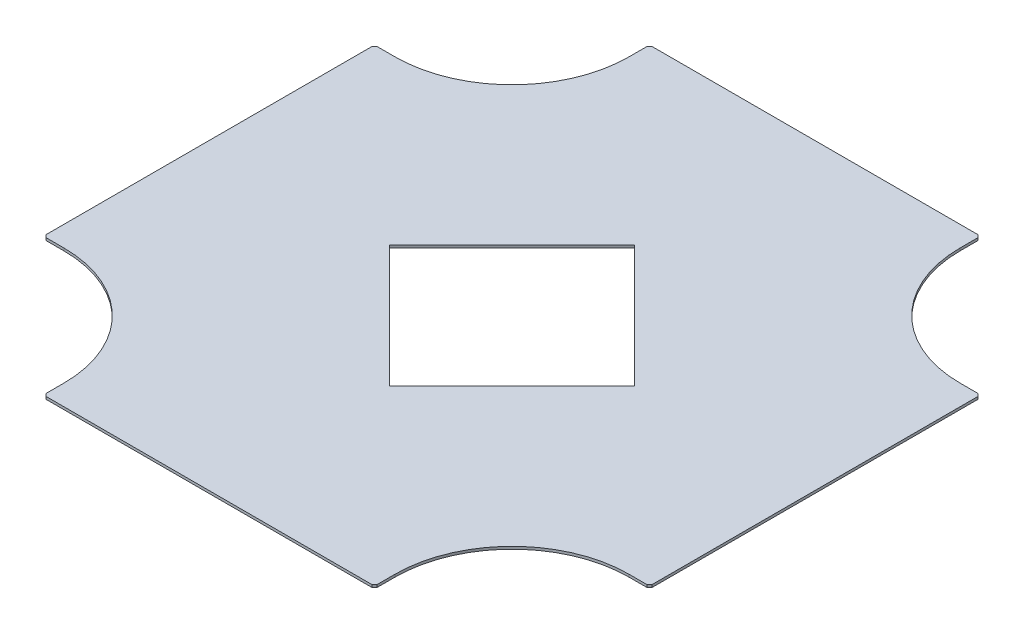
ISO-10303-21;
HEADER;
FILE_DESCRIPTION(('STEP AP214'),'2;1');
FILE_NAME('part.step','',(''),(''),'','','');
FILE_SCHEMA(('AUTOMOTIVE_DESIGN { 1 0 10303 214 1 1 1 1 }'));
ENDSEC;
DATA;
#1=APPLICATION_CONTEXT('core data for automotive mechanical design processes');
#2=APPLICATION_PROTOCOL_DEFINITION('international standard','automotive_design',2000,#1);
#3=PRODUCT_CONTEXT('',#1,'mechanical');
#4=PRODUCT('Part','Part','',(#3));
#5=PRODUCT_RELATED_PRODUCT_CATEGORY('part','',(#4));
#6=PRODUCT_DEFINITION_FORMATION('','',#4);
#7=PRODUCT_DEFINITION_CONTEXT('part definition',#1,'design');
#8=PRODUCT_DEFINITION('design','',#6,#7);
#9=PRODUCT_DEFINITION_SHAPE('','',#8);
#10=(LENGTH_UNIT() NAMED_UNIT(*) SI_UNIT(.MILLI.,.METRE.));
#11=(NAMED_UNIT(*) PLANE_ANGLE_UNIT() SI_UNIT($,.RADIAN.));
#12=(NAMED_UNIT(*) SI_UNIT($,.STERADIAN.) SOLID_ANGLE_UNIT());
#13=UNCERTAINTY_MEASURE_WITH_UNIT(LENGTH_MEASURE(1.E-05),#10,'distance_accuracy_value','');
#14=(GEOMETRIC_REPRESENTATION_CONTEXT(3) GLOBAL_UNCERTAINTY_ASSIGNED_CONTEXT((#13)) GLOBAL_UNIT_ASSIGNED_CONTEXT((#10,
#11,#12)) REPRESENTATION_CONTEXT('',''));
#15=CARTESIAN_POINT('',(0.,0.,0.));
#16=DIRECTION('',(0.,0.,1.));
#17=DIRECTION('',(1.,0.,0.));
#18=AXIS2_PLACEMENT_3D('',#15,#16,#17);
#19=CARTESIAN_POINT('',(377.825,-3.175,377.825));
#20=DIRECTION('',(1.,0.,0.));
#21=DIRECTION('',(0.,0.,-1.));
#22=AXIS2_PLACEMENT_3D('',#19,#20,#21);
#23=PLANE('',#22);
#24=DIRECTION('',(0.,0.,-1.));
#25=VECTOR('',#24,1.);
#26=CARTESIAN_POINT('',(377.825,-3.175,377.825));
#27=LINE('',#26,#25);
#28=CARTESIAN_POINT('',(377.825,-3.175,203.2));
#29=VERTEX_POINT('',#28);
#30=CARTESIAN_POINT('',(377.825,-3.175,-203.2));
#31=VERTEX_POINT('',#30);
#32=EDGE_CURVE('E402',#29,#31,#27,.T.);
#33=ORIENTED_EDGE('',*,*,#32,.T.);
#34=DIRECTION('',(0.,1.,0.));
#35=VECTOR('',#34,1.);
#36=CARTESIAN_POINT('',(377.825,0.,-203.2));
#37=LINE('',#36,#35);
#38=CARTESIAN_POINT('',(377.825,0.,-203.2));
#39=VERTEX_POINT('',#38);
#40=EDGE_CURVE('E493',#31,#39,#37,.T.);
#41=ORIENTED_EDGE('',*,*,#40,.T.);
#42=DIRECTION('',(0.,0.,-1.));
#43=VECTOR('',#42,1.);
#44=CARTESIAN_POINT('',(377.825,0.,377.825));
#45=LINE('',#44,#43);
#46=CARTESIAN_POINT('',(377.825,0.,203.2));
#47=VERTEX_POINT('',#46);
#48=EDGE_CURVE('E393',#47,#39,#45,.T.);
#49=ORIENTED_EDGE('',*,*,#48,.F.);
#50=DIRECTION('',(0.,-1.,0.));
#51=VECTOR('',#50,1.);
#52=CARTESIAN_POINT('',(377.825,-3.175,203.2));
#53=LINE('',#52,#51);
#54=EDGE_CURVE('E489',#47,#29,#53,.T.);
#55=ORIENTED_EDGE('',*,*,#54,.T.);
#56=EDGE_LOOP('',(#33,#41,#49,#55));
#57=FACE_BOUND('',#56,.T.);
#58=ADVANCED_FACE('F55',(#57),#23,.T.);
#59=CARTESIAN_POINT('',(-377.825,-3.175,377.825));
#60=DIRECTION('',(0.,0.,1.));
#61=DIRECTION('',(1.,0.,0.));
#62=AXIS2_PLACEMENT_3D('',#59,#60,#61);
#63=PLANE('',#62);
#64=DIRECTION('',(1.,0.,0.));
#65=VECTOR('',#64,1.);
#66=CARTESIAN_POINT('',(-377.825,-3.175,377.825));
#67=LINE('',#66,#65);
#68=CARTESIAN_POINT('',(-203.2,-3.175,377.825));
#69=VERTEX_POINT('',#68);
#70=CARTESIAN_POINT('',(203.2,-3.175,377.825));
#71=VERTEX_POINT('',#70);
#72=EDGE_CURVE('E414',#69,#71,#67,.T.);
#73=ORIENTED_EDGE('',*,*,#72,.T.);
#74=DIRECTION('',(0.,1.,0.));
#75=VECTOR('',#74,1.);
#76=CARTESIAN_POINT('',(203.2,0.,377.825));
#77=LINE('',#76,#75);
#78=CARTESIAN_POINT('',(203.2,0.,377.825));
#79=VERTEX_POINT('',#78);
#80=EDGE_CURVE('E476',#71,#79,#77,.T.);
#81=ORIENTED_EDGE('',*,*,#80,.T.);
#82=DIRECTION('',(1.,0.,0.));
#83=VECTOR('',#82,1.);
#84=CARTESIAN_POINT('',(-377.825,0.,377.825));
#85=LINE('',#84,#83);
#86=CARTESIAN_POINT('',(-203.2,0.,377.825));
#87=VERTEX_POINT('',#86);
#88=EDGE_CURVE('E407',#87,#79,#85,.T.);
#89=ORIENTED_EDGE('',*,*,#88,.F.);
#90=DIRECTION('',(0.,-1.,0.));
#91=VECTOR('',#90,1.);
#92=CARTESIAN_POINT('',(-203.2,-3.175,377.825));
#93=LINE('',#92,#91);
#94=EDGE_CURVE('E472',#87,#69,#93,.T.);
#95=ORIENTED_EDGE('',*,*,#94,.T.);
#96=EDGE_LOOP('',(#73,#81,#89,#95));
#97=FACE_BOUND('',#96,.T.);
#98=ADVANCED_FACE('F519',(#97),#63,.T.);
#99=CARTESIAN_POINT('',(-377.825,-3.175,377.825));
#100=DIRECTION('',(-1.,0.,0.));
#101=DIRECTION('',(0.,0.,1.));
#102=AXIS2_PLACEMENT_3D('',#99,#100,#101);
#103=PLANE('',#102);
#104=DIRECTION('',(0.,0.,1.));
#105=VECTOR('',#104,1.);
#106=CARTESIAN_POINT('',(-377.825,-3.175,377.825));
#107=LINE('',#106,#105);
#108=CARTESIAN_POINT('',(-377.825,-3.175,-203.2));
#109=VERTEX_POINT('',#108);
#110=CARTESIAN_POINT('',(-377.825,-3.175,203.2));
#111=VERTEX_POINT('',#110);
#112=EDGE_CURVE('E410',#109,#111,#107,.T.);
#113=ORIENTED_EDGE('',*,*,#112,.T.);
#114=DIRECTION('',(0.,1.,0.));
#115=VECTOR('',#114,1.);
#116=CARTESIAN_POINT('',(-377.825,0.,203.2));
#117=LINE('',#116,#115);
#118=CARTESIAN_POINT('',(-377.825,0.,203.2));
#119=VERTEX_POINT('',#118);
#120=EDGE_CURVE('E458',#111,#119,#117,.T.);
#121=ORIENTED_EDGE('',*,*,#120,.T.);
#122=DIRECTION('',(0.,0.,1.));
#123=VECTOR('',#122,1.);
#124=CARTESIAN_POINT('',(-377.825,0.,377.825));
#125=LINE('',#124,#123);
#126=CARTESIAN_POINT('',(-377.825,0.,-203.2));
#127=VERTEX_POINT('',#126);
#128=EDGE_CURVE('E423',#127,#119,#125,.T.);
#129=ORIENTED_EDGE('',*,*,#128,.F.);
#130=DIRECTION('',(0.,-1.,0.));
#131=VECTOR('',#130,1.);
#132=CARTESIAN_POINT('',(-377.825,-3.175,-203.2));
#133=LINE('',#132,#131);
#134=EDGE_CURVE('E452',#127,#109,#133,.T.);
#135=ORIENTED_EDGE('',*,*,#134,.T.);
#136=EDGE_LOOP('',(#113,#121,#129,#135));
#137=FACE_BOUND('',#136,.T.);
#138=ADVANCED_FACE('F525',(#137),#103,.T.);
#139=CARTESIAN_POINT('',(-377.825,-3.175,-377.825));
#140=DIRECTION('',(0.,0.,-1.));
#141=DIRECTION('',(-1.,0.,0.));
#142=AXIS2_PLACEMENT_3D('',#139,#140,#141);
#143=PLANE('',#142);
#144=DIRECTION('',(-1.,0.,0.));
#145=VECTOR('',#144,1.);
#146=CARTESIAN_POINT('',(-377.825,-3.175,-377.825));
#147=LINE('',#146,#145);
#148=CARTESIAN_POINT('',(203.2,-3.175,-377.825));
#149=VERTEX_POINT('',#148);
#150=CARTESIAN_POINT('',(-203.2,-3.175,-377.825));
#151=VERTEX_POINT('',#150);
#152=EDGE_CURVE('E406',#149,#151,#147,.T.);
#153=ORIENTED_EDGE('',*,*,#152,.T.);
#154=DIRECTION('',(0.,1.,0.));
#155=VECTOR('',#154,1.);
#156=CARTESIAN_POINT('',(-203.2,0.,-377.825));
#157=LINE('',#156,#155);
#158=CARTESIAN_POINT('',(-203.2,0.,-377.825));
#159=VERTEX_POINT('',#158);
#160=EDGE_CURVE('E436',#151,#159,#157,.T.);
#161=ORIENTED_EDGE('',*,*,#160,.T.);
#162=DIRECTION('',(-1.,0.,0.));
#163=VECTOR('',#162,1.);
#164=CARTESIAN_POINT('',(-377.825,0.,-377.825));
#165=LINE('',#164,#163);
#166=CARTESIAN_POINT('',(203.2,0.,-377.825));
#167=VERTEX_POINT('',#166);
#168=EDGE_CURVE('E420',#167,#159,#165,.T.);
#169=ORIENTED_EDGE('',*,*,#168,.F.);
#170=DIRECTION('',(0.,-1.,0.));
#171=VECTOR('',#170,1.);
#172=CARTESIAN_POINT('',(203.2,-3.175,-377.825));
#173=LINE('',#172,#171);
#174=EDGE_CURVE('E432',#167,#149,#173,.T.);
#175=ORIENTED_EDGE('',*,*,#174,.T.);
#176=EDGE_LOOP('',(#153,#161,#169,#175));
#177=FACE_BOUND('',#176,.T.);
#178=ADVANCED_FACE('F530',(#177),#143,.T.);
#179=CARTESIAN_POINT('',(0.,-3.175,0.));
#180=DIRECTION('',(0.,-1.,0.));
#181=DIRECTION('',(0.,0.,-1.));
#182=AXIS2_PLACEMENT_3D('',#179,#180,#181);
#183=PLANE('',#182);
#184=DIRECTION('',(1.,0.,0.));
#185=VECTOR('',#184,1.);
#186=CARTESIAN_POINT('',(377.825,-3.175,-206.375));
#187=LINE('',#186,#185);
#188=CARTESIAN_POINT('',(352.425,-3.175,-206.375));
#189=VERTEX_POINT('',#188);
#190=CARTESIAN_POINT('',(374.65,-3.175,-206.375));
#191=VERTEX_POINT('',#190);
#192=EDGE_CURVE('E346',#189,#191,#187,.T.);
#193=ORIENTED_EDGE('',*,*,#192,.T.);
#194=DIRECTION('',(0.707106781186548,0.,0.707106781186548));
#195=VECTOR('',#194,1.);
#196=CARTESIAN_POINT('',(290.5125,-3.175,-290.5125));
#197=LINE('',#196,#195);
#198=EDGE_CURVE('E11',#191,#31,#197,.T.);
#199=ORIENTED_EDGE('',*,*,#198,.T.);
#200=ORIENTED_EDGE('',*,*,#32,.F.);
#201=DIRECTION('',(-0.707106781186551,0.,0.707106781186544));
#202=VECTOR('',#201,1.);
#203=CARTESIAN_POINT('',(290.512499999998,-3.175,290.512500000001));
#204=LINE('',#203,#202);
#205=CARTESIAN_POINT('',(374.65,-3.175,206.375));
#206=VERTEX_POINT('',#205);
#207=EDGE_CURVE('E491',#29,#206,#204,.T.);
#208=ORIENTED_EDGE('',*,*,#207,.T.);
#209=DIRECTION('',(-1.,0.,0.));
#210=VECTOR('',#209,1.);
#211=CARTESIAN_POINT('',(352.425,-3.175,206.375));
#212=LINE('',#211,#210);
#213=CARTESIAN_POINT('',(352.425,-3.175,206.375));
#214=VERTEX_POINT('',#213);
#215=EDGE_CURVE('E279',#206,#214,#212,.T.);
#216=ORIENTED_EDGE('',*,*,#215,.T.);
#217=CARTESIAN_POINT('',(352.425,-3.175,352.425));
#218=DIRECTION('',(0.,1.,0.));
#219=DIRECTION('',(0.,0.,-1.));
#220=AXIS2_PLACEMENT_3D('',#217,#218,#219);
#221=CIRCLE('',#220,146.05);
#222=CARTESIAN_POINT('',(206.375,-3.175,352.425));
#223=VERTEX_POINT('',#222);
#224=EDGE_CURVE('E281',#214,#223,#221,.T.);
#225=ORIENTED_EDGE('',*,*,#224,.T.);
#226=DIRECTION('',(0.,0.,1.));
#227=VECTOR('',#226,1.);
#228=CARTESIAN_POINT('',(206.375,-3.175,377.825));
#229=LINE('',#228,#227);
#230=CARTESIAN_POINT('',(206.375,-3.175,374.65));
#231=VERTEX_POINT('',#230);
#232=EDGE_CURVE('E261',#223,#231,#229,.T.);
#233=ORIENTED_EDGE('',*,*,#232,.T.);
#234=DIRECTION('',(-0.707106781186544,0.,0.707106781186551));
#235=VECTOR('',#234,1.);
#236=CARTESIAN_POINT('',(290.512500000001,-3.175,290.512499999998));
#237=LINE('',#236,#235);
#238=EDGE_CURVE('E482',#231,#71,#237,.T.);
#239=ORIENTED_EDGE('',*,*,#238,.T.);
#240=ORIENTED_EDGE('',*,*,#72,.F.);
#241=DIRECTION('',(-0.707106781186544,0.,-0.707106781186551));
#242=VECTOR('',#241,1.);
#243=CARTESIAN_POINT('',(-290.512500000001,-3.175,290.512499999998));
#244=LINE('',#243,#242);
#245=CARTESIAN_POINT('',(-206.375,-3.175,374.65));
#246=VERTEX_POINT('',#245);
#247=EDGE_CURVE('E474',#69,#246,#244,.T.);
#248=ORIENTED_EDGE('',*,*,#247,.T.);
#249=DIRECTION('',(0.,0.,-1.));
#250=VECTOR('',#249,1.);
#251=CARTESIAN_POINT('',(-206.375,-3.175,352.425));
#252=LINE('',#251,#250);
#253=CARTESIAN_POINT('',(-206.375,-3.175,352.425));
#254=VERTEX_POINT('',#253);
#255=EDGE_CURVE('E301',#246,#254,#252,.T.);
#256=ORIENTED_EDGE('',*,*,#255,.T.);
#257=CARTESIAN_POINT('',(-352.425,-3.175,352.425));
#258=DIRECTION('',(0.,1.,0.));
#259=DIRECTION('',(0.,0.,-1.));
#260=AXIS2_PLACEMENT_3D('',#257,#258,#259);
#261=CIRCLE('',#260,146.05);
#262=CARTESIAN_POINT('',(-352.425,-3.175,206.375));
#263=VERTEX_POINT('',#262);
#264=EDGE_CURVE('E309',#254,#263,#261,.T.);
#265=ORIENTED_EDGE('',*,*,#264,.T.);
#266=DIRECTION('',(-1.,0.,0.));
#267=VECTOR('',#266,1.);
#268=CARTESIAN_POINT('',(-377.825,-3.175,206.375));
#269=LINE('',#268,#267);
#270=CARTESIAN_POINT('',(-374.65,-3.175,206.375));
#271=VERTEX_POINT('',#270);
#272=EDGE_CURVE('E293',#263,#271,#269,.T.);
#273=ORIENTED_EDGE('',*,*,#272,.T.);
#274=DIRECTION('',(-0.707106781186551,0.,-0.707106781186544));
#275=VECTOR('',#274,1.);
#276=CARTESIAN_POINT('',(-290.512499999998,-3.175,290.512500000001));
#277=LINE('',#276,#275);
#278=EDGE_CURVE('E465',#271,#111,#277,.T.);
#279=ORIENTED_EDGE('',*,*,#278,.T.);
#280=ORIENTED_EDGE('',*,*,#112,.F.);
#281=DIRECTION('',(0.707106781186557,0.,-0.707106781186538));
#282=VECTOR('',#281,1.);
#283=CARTESIAN_POINT('',(-290.512499999995,-3.175,-290.512500000003));
#284=LINE('',#283,#282);
#285=CARTESIAN_POINT('',(-374.65,-3.175,-206.375));
#286=VERTEX_POINT('',#285);
#287=EDGE_CURVE('E455',#109,#286,#284,.T.);
#288=ORIENTED_EDGE('',*,*,#287,.T.);
#289=DIRECTION('',(1.,0.,0.));
#290=VECTOR('',#289,1.);
#291=CARTESIAN_POINT('',(-352.425,-3.175,-206.375));
#292=LINE('',#291,#290);
#293=CARTESIAN_POINT('',(-352.425,-3.175,-206.375));
#294=VERTEX_POINT('',#293);
#295=EDGE_CURVE('E326',#286,#294,#292,.T.);
#296=ORIENTED_EDGE('',*,*,#295,.T.);
#297=CARTESIAN_POINT('',(-352.425,-3.175,-352.425));
#298=DIRECTION('',(0.,1.,0.));
#299=DIRECTION('',(0.,0.,-1.));
#300=AXIS2_PLACEMENT_3D('',#297,#298,#299);
#301=CIRCLE('',#300,146.05);
#302=CARTESIAN_POINT('',(-206.375,-3.175,-352.425));
#303=VERTEX_POINT('',#302);
#304=EDGE_CURVE('E334',#294,#303,#301,.T.);
#305=ORIENTED_EDGE('',*,*,#304,.T.);
#306=DIRECTION('',(0.,0.,-1.));
#307=VECTOR('',#306,1.);
#308=CARTESIAN_POINT('',(-206.375,-3.175,-377.825));
#309=LINE('',#308,#307);
#310=CARTESIAN_POINT('',(-206.375,-3.175,-374.65));
#311=VERTEX_POINT('',#310);
#312=EDGE_CURVE('E319',#303,#311,#309,.T.);
#313=ORIENTED_EDGE('',*,*,#312,.T.);
#314=DIRECTION('',(0.707106781186544,0.,-0.707106781186551));
#315=VECTOR('',#314,1.);
#316=CARTESIAN_POINT('',(-290.512500000001,-3.175,-290.512499999998));
#317=LINE('',#316,#315);
#318=EDGE_CURVE('E443',#311,#151,#317,.T.);
#319=ORIENTED_EDGE('',*,*,#318,.T.);
#320=ORIENTED_EDGE('',*,*,#152,.F.);
#321=DIRECTION('',(0.707106781186541,0.,0.707106781186554));
#322=VECTOR('',#321,1.);
#323=CARTESIAN_POINT('',(290.512500000002,-3.175,-290.512499999997));
#324=LINE('',#323,#322);
#325=CARTESIAN_POINT('',(206.375,-3.175,-374.65));
#326=VERTEX_POINT('',#325);
#327=EDGE_CURVE('E434',#149,#326,#324,.T.);
#328=ORIENTED_EDGE('',*,*,#327,.T.);
#329=DIRECTION('',(0.,0.,1.));
#330=VECTOR('',#329,1.);
#331=CARTESIAN_POINT('',(206.375,-3.175,-352.425));
#332=LINE('',#331,#330);
#333=CARTESIAN_POINT('',(206.375,-3.175,-352.425));
#334=VERTEX_POINT('',#333);
#335=EDGE_CURVE('E340',#326,#334,#332,.T.);
#336=ORIENTED_EDGE('',*,*,#335,.T.);
#337=CARTESIAN_POINT('',(352.425,-3.175,-352.425));
#338=DIRECTION('',(0.,1.,0.));
#339=DIRECTION('',(0.,0.,-1.));
#340=AXIS2_PLACEMENT_3D('',#337,#338,#339);
#341=CIRCLE('',#340,146.05);
#342=EDGE_CURVE('E342',#334,#189,#341,.T.);
#343=ORIENTED_EDGE('',*,*,#342,.T.);
#344=EDGE_LOOP('',(#193,#199,#200,#208,#216,#225,#233,#239,#240,#248,#256,#265,#273,#279,#280,
#288,#296,#305,#313,#319,#320,#328,#336,#343));
#345=FACE_BOUND('',#344,.T.);
#346=DIRECTION('',(0.707106781186548,0.,0.707106781186547));
#347=VECTOR('',#346,1.);
#348=CARTESIAN_POINT('',(0.,-3.175,152.664354058176));
#349=LINE('',#348,#347);
#350=CARTESIAN_POINT('',(-152.664354058176,-3.175,0.));
#351=VERTEX_POINT('',#350);
#352=CARTESIAN_POINT('',(0.,-3.175,152.664354058176));
#353=VERTEX_POINT('',#352);
#354=EDGE_CURVE('E359',#351,#353,#349,.T.);
#355=ORIENTED_EDGE('',*,*,#354,.T.);
#356=DIRECTION('',(0.707106781186547,0.,-0.707106781186547));
#357=VECTOR('',#356,1.);
#358=CARTESIAN_POINT('',(0.,-3.175,152.664354058176));
#359=LINE('',#358,#357);
#360=CARTESIAN_POINT('',(152.664354058176,-3.175,0.));
#361=VERTEX_POINT('',#360);
#362=EDGE_CURVE('E363',#353,#361,#359,.T.);
#363=ORIENTED_EDGE('',*,*,#362,.T.);
#364=DIRECTION('',(-0.707106781186548,0.,-0.707106781186547));
#365=VECTOR('',#364,1.);
#366=CARTESIAN_POINT('',(152.664354058176,-3.175,0.));
#367=LINE('',#366,#365);
#368=CARTESIAN_POINT('',(0.,-3.175,-152.664354058176));
#369=VERTEX_POINT('',#368);
#370=EDGE_CURVE('E368',#361,#369,#367,.T.);
#371=ORIENTED_EDGE('',*,*,#370,.T.);
#372=DIRECTION('',(-0.707106781186547,0.,0.707106781186548));
#373=VECTOR('',#372,1.);
#374=CARTESIAN_POINT('',(-152.664354058176,-3.175,0.));
#375=LINE('',#374,#373);
#376=EDGE_CURVE('E372',#369,#351,#375,.T.);
#377=ORIENTED_EDGE('',*,*,#376,.T.);
#378=EDGE_LOOP('',(#355,#363,#371,#377));
#379=FACE_BOUND('',#378,.T.);
#380=ADVANCED_FACE('F511',(#345,#379),#183,.T.);
#381=CARTESIAN_POINT('',(0.,0.,0.));
#382=DIRECTION('',(0.,-1.,0.));
#383=DIRECTION('',(0.,0.,-1.));
#384=AXIS2_PLACEMENT_3D('',#381,#382,#383);
#385=PLANE('',#384);
#386=DIRECTION('',(0.707106781186547,0.,-0.707106781186547));
#387=VECTOR('',#386,1.);
#388=CARTESIAN_POINT('',(0.,0.,152.664354058176));
#389=LINE('',#388,#387);
#390=CARTESIAN_POINT('',(0.,0.,152.664354058176));
#391=VERTEX_POINT('',#390);
#392=CARTESIAN_POINT('',(152.664354058176,0.,0.));
#393=VERTEX_POINT('',#392);
#394=EDGE_CURVE('E379',#391,#393,#389,.T.);
#395=ORIENTED_EDGE('',*,*,#394,.F.);
#396=DIRECTION('',(0.707106781186548,0.,0.707106781186547));
#397=VECTOR('',#396,1.);
#398=CARTESIAN_POINT('',(0.,0.,152.664354058176));
#399=LINE('',#398,#397);
#400=CARTESIAN_POINT('',(-152.664354058176,0.,0.));
#401=VERTEX_POINT('',#400);
#402=EDGE_CURVE('E356',#401,#391,#399,.T.);
#403=ORIENTED_EDGE('',*,*,#402,.F.);
#404=DIRECTION('',(-0.707106781186547,0.,0.707106781186548));
#405=VECTOR('',#404,1.);
#406=CARTESIAN_POINT('',(-152.664354058176,0.,0.));
#407=LINE('',#406,#405);
#408=CARTESIAN_POINT('',(0.,0.,-152.664354058176));
#409=VERTEX_POINT('',#408);
#410=EDGE_CURVE('E364',#409,#401,#407,.T.);
#411=ORIENTED_EDGE('',*,*,#410,.F.);
#412=DIRECTION('',(-0.707106781186548,0.,-0.707106781186547));
#413=VECTOR('',#412,1.);
#414=CARTESIAN_POINT('',(152.664354058176,0.,0.));
#415=LINE('',#414,#413);
#416=EDGE_CURVE('E383',#393,#409,#415,.T.);
#417=ORIENTED_EDGE('',*,*,#416,.F.);
#418=EDGE_LOOP('',(#395,#403,#411,#417));
#419=FACE_BOUND('',#418,.T.);
#420=ORIENTED_EDGE('',*,*,#48,.T.);
#421=DIRECTION('',(-0.707106781186548,0.,-0.707106781186548));
#422=VECTOR('',#421,1.);
#423=CARTESIAN_POINT('',(377.825,0.,-203.2));
#424=LINE('',#423,#422);
#425=CARTESIAN_POINT('',(374.65,0.,-206.375));
#426=VERTEX_POINT('',#425);
#427=EDGE_CURVE('E78',#39,#426,#424,.T.);
#428=ORIENTED_EDGE('',*,*,#427,.T.);
#429=DIRECTION('',(1.,0.,0.));
#430=VECTOR('',#429,1.);
#431=CARTESIAN_POINT('',(377.825,0.,-206.375));
#432=LINE('',#431,#430);
#433=CARTESIAN_POINT('',(352.425,0.,-206.375));
#434=VERTEX_POINT('',#433);
#435=EDGE_CURVE('E343',#434,#426,#432,.T.);
#436=ORIENTED_EDGE('',*,*,#435,.F.);
#437=CARTESIAN_POINT('',(352.425,0.,-352.425));
#438=DIRECTION('',(0.,1.,0.));
#439=DIRECTION('',(0.,0.,-1.));
#440=AXIS2_PLACEMENT_3D('',#437,#438,#439);
#441=CIRCLE('',#440,146.05);
#442=CARTESIAN_POINT('',(206.375,0.,-352.425));
#443=VERTEX_POINT('',#442);
#444=EDGE_CURVE('E350',#443,#434,#441,.T.);
#445=ORIENTED_EDGE('',*,*,#444,.F.);
#446=DIRECTION('',(0.,0.,1.));
#447=VECTOR('',#446,1.);
#448=CARTESIAN_POINT('',(206.375,0.,-352.425));
#449=LINE('',#448,#447);
#450=CARTESIAN_POINT('',(206.375,0.,-374.65));
#451=VERTEX_POINT('',#450);
#452=EDGE_CURVE('E286',#451,#443,#449,.T.);
#453=ORIENTED_EDGE('',*,*,#452,.F.);
#454=DIRECTION('',(-0.707106781186541,0.,-0.707106781186554));
#455=VECTOR('',#454,1.);
#456=CARTESIAN_POINT('',(206.375,0.,-374.65));
#457=LINE('',#456,#455);
#458=EDGE_CURVE('E430',#451,#167,#457,.T.);
#459=ORIENTED_EDGE('',*,*,#458,.T.);
#460=ORIENTED_EDGE('',*,*,#168,.T.);
#461=DIRECTION('',(-0.707106781186544,0.,0.707106781186551));
#462=VECTOR('',#461,1.);
#463=CARTESIAN_POINT('',(-203.2,0.,-377.825));
#464=LINE('',#463,#462);
#465=CARTESIAN_POINT('',(-206.375,0.,-374.65));
#466=VERTEX_POINT('',#465);
#467=EDGE_CURVE('E439',#159,#466,#464,.T.);
#468=ORIENTED_EDGE('',*,*,#467,.T.);
#469=DIRECTION('',(0.,0.,-1.));
#470=VECTOR('',#469,1.);
#471=CARTESIAN_POINT('',(-206.375,0.,-377.825));
#472=LINE('',#471,#470);
#473=CARTESIAN_POINT('',(-206.375,0.,-352.425));
#474=VERTEX_POINT('',#473);
#475=EDGE_CURVE('E322',#474,#466,#472,.T.);
#476=ORIENTED_EDGE('',*,*,#475,.F.);
#477=CARTESIAN_POINT('',(-352.425,0.,-352.425));
#478=DIRECTION('',(0.,1.,0.));
#479=DIRECTION('',(0.,0.,-1.));
#480=AXIS2_PLACEMENT_3D('',#477,#478,#479);
#481=CIRCLE('',#480,146.05);
#482=CARTESIAN_POINT('',(-352.425,0.,-206.375));
#483=VERTEX_POINT('',#482);
#484=EDGE_CURVE('E325',#483,#474,#481,.T.);
#485=ORIENTED_EDGE('',*,*,#484,.F.);
#486=DIRECTION('',(1.,0.,0.));
#487=VECTOR('',#486,1.);
#488=CARTESIAN_POINT('',(-352.425,0.,-206.375));
#489=LINE('',#488,#487);
#490=CARTESIAN_POINT('',(-374.65,0.,-206.375));
#491=VERTEX_POINT('',#490);
#492=EDGE_CURVE('E296',#491,#483,#489,.T.);
#493=ORIENTED_EDGE('',*,*,#492,.F.);
#494=DIRECTION('',(-0.707106781186557,0.,0.707106781186538));
#495=VECTOR('',#494,1.);
#496=CARTESIAN_POINT('',(-374.65,0.,-206.375));
#497=LINE('',#496,#495);
#498=EDGE_CURVE('E449',#491,#127,#497,.T.);
#499=ORIENTED_EDGE('',*,*,#498,.T.);
#500=ORIENTED_EDGE('',*,*,#128,.T.);
#501=DIRECTION('',(0.707106781186551,0.,0.707106781186544));
#502=VECTOR('',#501,1.);
#503=CARTESIAN_POINT('',(-377.825,0.,203.2));
#504=LINE('',#503,#502);
#505=CARTESIAN_POINT('',(-374.65,0.,206.375));
#506=VERTEX_POINT('',#505);
#507=EDGE_CURVE('E461',#119,#506,#504,.T.);
#508=ORIENTED_EDGE('',*,*,#507,.T.);
#509=DIRECTION('',(-1.,0.,0.));
#510=VECTOR('',#509,1.);
#511=CARTESIAN_POINT('',(-377.825,0.,206.375));
#512=LINE('',#511,#510);
#513=CARTESIAN_POINT('',(-352.425,0.,206.375));
#514=VERTEX_POINT('',#513);
#515=EDGE_CURVE('E297',#514,#506,#512,.T.);
#516=ORIENTED_EDGE('',*,*,#515,.F.);
#517=CARTESIAN_POINT('',(-352.425,0.,352.425));
#518=DIRECTION('',(0.,1.,0.));
#519=DIRECTION('',(0.,0.,-1.));
#520=AXIS2_PLACEMENT_3D('',#517,#518,#519);
#521=CIRCLE('',#520,146.05);
#522=CARTESIAN_POINT('',(-206.375,0.,352.425));
#523=VERTEX_POINT('',#522);
#524=EDGE_CURVE('E300',#523,#514,#521,.T.);
#525=ORIENTED_EDGE('',*,*,#524,.F.);
#526=DIRECTION('',(0.,0.,-1.));
#527=VECTOR('',#526,1.);
#528=CARTESIAN_POINT('',(-206.375,0.,352.425));
#529=LINE('',#528,#527);
#530=CARTESIAN_POINT('',(-206.375,0.,374.65));
#531=VERTEX_POINT('',#530);
#532=EDGE_CURVE('E266',#531,#523,#529,.T.);
#533=ORIENTED_EDGE('',*,*,#532,.F.);
#534=DIRECTION('',(0.707106781186544,0.,0.707106781186551));
#535=VECTOR('',#534,1.);
#536=CARTESIAN_POINT('',(-206.375,0.,374.65));
#537=LINE('',#536,#535);
#538=EDGE_CURVE('E470',#531,#87,#537,.T.);
#539=ORIENTED_EDGE('',*,*,#538,.T.);
#540=ORIENTED_EDGE('',*,*,#88,.T.);
#541=DIRECTION('',(0.707106781186544,0.,-0.707106781186551));
#542=VECTOR('',#541,1.);
#543=CARTESIAN_POINT('',(203.2,0.,377.825));
#544=LINE('',#543,#542);
#545=CARTESIAN_POINT('',(206.375,0.,374.65));
#546=VERTEX_POINT('',#545);
#547=EDGE_CURVE('E278',#79,#546,#544,.T.);
#548=ORIENTED_EDGE('',*,*,#547,.T.);
#549=DIRECTION('',(0.,0.,1.));
#550=VECTOR('',#549,1.);
#551=CARTESIAN_POINT('',(206.375,0.,377.825));
#552=LINE('',#551,#550);
#553=CARTESIAN_POINT('',(206.375,0.,352.425));
#554=VERTEX_POINT('',#553);
#555=EDGE_CURVE('E258',#554,#546,#552,.T.);
#556=ORIENTED_EDGE('',*,*,#555,.F.);
#557=CARTESIAN_POINT('',(352.425,0.,352.425));
#558=DIRECTION('',(0.,1.,0.));
#559=DIRECTION('',(0.,0.,-1.));
#560=AXIS2_PLACEMENT_3D('',#557,#558,#559);
#561=CIRCLE('',#560,146.05);
#562=CARTESIAN_POINT('',(352.425,0.,206.375));
#563=VERTEX_POINT('',#562);
#564=EDGE_CURVE('E270',#563,#554,#561,.T.);
#565=ORIENTED_EDGE('',*,*,#564,.F.);
#566=DIRECTION('',(-1.,0.,0.));
#567=VECTOR('',#566,1.);
#568=CARTESIAN_POINT('',(352.425,0.,206.375));
#569=LINE('',#568,#567);
#570=CARTESIAN_POINT('',(374.65,0.,206.375));
#571=VERTEX_POINT('',#570);
#572=EDGE_CURVE('E274',#571,#563,#569,.T.);
#573=ORIENTED_EDGE('',*,*,#572,.F.);
#574=DIRECTION('',(0.707106781186551,0.,-0.707106781186544));
#575=VECTOR('',#574,1.);
#576=CARTESIAN_POINT('',(374.65,0.,206.375));
#577=LINE('',#576,#575);
#578=EDGE_CURVE('E487',#571,#47,#577,.T.);
#579=ORIENTED_EDGE('',*,*,#578,.T.);
#580=EDGE_LOOP('',(#420,#428,#436,#445,#453,#459,#460,#468,#476,#485,#493,#499,#500,#508,#516,
#525,#533,#539,#540,#548,#556,#565,#573,#579));
#581=FACE_BOUND('',#580,.T.);
#582=ADVANCED_FACE('F276',(#419,#581),#385,.F.);
#583=CARTESIAN_POINT('',(0.,-3.175,152.664354058176));
#584=DIRECTION('',(-0.707106781186547,0.,0.707106781186548));
#585=DIRECTION('',(0.707106781186548,0.,0.707106781186547));
#586=AXIS2_PLACEMENT_3D('',#583,#584,#585);
#587=PLANE('',#586);
#588=ORIENTED_EDGE('',*,*,#402,.T.);
#589=DIRECTION('',(0.,1.,0.));
#590=VECTOR('',#589,1.);
#591=CARTESIAN_POINT('',(0.,-3.175,152.664354058176));
#592=LINE('',#591,#590);
#593=EDGE_CURVE('E376',#353,#391,#592,.T.);
#594=ORIENTED_EDGE('',*,*,#593,.F.);
#595=ORIENTED_EDGE('',*,*,#354,.F.);
#596=DIRECTION('',(0.,1.,0.));
#597=VECTOR('',#596,1.);
#598=CARTESIAN_POINT('',(-152.664354058176,-3.175,0.));
#599=LINE('',#598,#597);
#600=EDGE_CURVE('E390',#351,#401,#599,.T.);
#601=ORIENTED_EDGE('',*,*,#600,.T.);
#602=EDGE_LOOP('',(#588,#594,#595,#601));
#603=FACE_BOUND('',#602,.T.);
#604=ADVANCED_FACE('F659',(#603),#587,.F.);
#605=CARTESIAN_POINT('',(-152.664354058176,-3.175,0.));
#606=DIRECTION('',(-0.707106781186548,0.,-0.707106781186547));
#607=DIRECTION('',(-0.707106781186547,0.,0.707106781186548));
#608=AXIS2_PLACEMENT_3D('',#605,#606,#607);
#609=PLANE('',#608);
#610=ORIENTED_EDGE('',*,*,#410,.T.);
#611=ORIENTED_EDGE('',*,*,#600,.F.);
#612=ORIENTED_EDGE('',*,*,#376,.F.);
#613=DIRECTION('',(0.,1.,0.));
#614=VECTOR('',#613,1.);
#615=CARTESIAN_POINT('',(0.,-3.175,-152.664354058176));
#616=LINE('',#615,#614);
#617=EDGE_CURVE('E394',#369,#409,#616,.T.);
#618=ORIENTED_EDGE('',*,*,#617,.T.);
#619=EDGE_LOOP('',(#610,#611,#612,#618));
#620=FACE_BOUND('',#619,.T.);
#621=ADVANCED_FACE('F656',(#620),#609,.F.);
#622=CARTESIAN_POINT('',(152.664354058176,-3.175,0.));
#623=DIRECTION('',(0.707106781186547,0.,-0.707106781186548));
#624=DIRECTION('',(-0.707106781186548,0.,-0.707106781186547));
#625=AXIS2_PLACEMENT_3D('',#622,#623,#624);
#626=PLANE('',#625);
#627=ORIENTED_EDGE('',*,*,#416,.T.);
#628=ORIENTED_EDGE('',*,*,#617,.F.);
#629=ORIENTED_EDGE('',*,*,#370,.F.);
#630=DIRECTION('',(0.,1.,0.));
#631=VECTOR('',#630,1.);
#632=CARTESIAN_POINT('',(152.664354058176,-3.175,0.));
#633=LINE('',#632,#631);
#634=EDGE_CURVE('E397',#361,#393,#633,.T.);
#635=ORIENTED_EDGE('',*,*,#634,.T.);
#636=EDGE_LOOP('',(#627,#628,#629,#635));
#637=FACE_BOUND('',#636,.T.);
#638=ADVANCED_FACE('F649',(#637),#626,.F.);
#639=CARTESIAN_POINT('',(0.,-3.175,152.664354058176));
#640=DIRECTION('',(0.707106781186548,0.,0.707106781186548));
#641=DIRECTION('',(0.707106781186548,0.,-0.707106781186548));
#642=AXIS2_PLACEMENT_3D('',#639,#640,#641);
#643=PLANE('',#642);
#644=ORIENTED_EDGE('',*,*,#394,.T.);
#645=ORIENTED_EDGE('',*,*,#634,.F.);
#646=ORIENTED_EDGE('',*,*,#362,.F.);
#647=ORIENTED_EDGE('',*,*,#593,.T.);
#648=EDGE_LOOP('',(#644,#645,#646,#647));
#649=FACE_BOUND('',#648,.T.);
#650=ADVANCED_FACE('F640',(#649),#643,.F.);
#651=CARTESIAN_POINT('',(377.825,-3.175,-206.375));
#652=DIRECTION('',(0.,0.,1.));
#653=DIRECTION('',(1.,0.,0.));
#654=AXIS2_PLACEMENT_3D('',#651,#652,#653);
#655=PLANE('',#654);
#656=ORIENTED_EDGE('',*,*,#435,.T.);
#657=DIRECTION('',(0.,-1.,0.));
#658=VECTOR('',#657,1.);
#659=CARTESIAN_POINT('',(374.65,-3.175,-206.375));
#660=LINE('',#659,#658);
#661=EDGE_CURVE('E64',#426,#191,#660,.T.);
#662=ORIENTED_EDGE('',*,*,#661,.T.);
#663=ORIENTED_EDGE('',*,*,#192,.F.);
#664=DIRECTION('',(0.,1.,0.));
#665=VECTOR('',#664,1.);
#666=CARTESIAN_POINT('',(352.425,-3.175,-206.375));
#667=LINE('',#666,#665);
#668=EDGE_CURVE('E354',#189,#434,#667,.T.);
#669=ORIENTED_EDGE('',*,*,#668,.T.);
#670=EDGE_LOOP('',(#656,#662,#663,#669));
#671=FACE_BOUND('',#670,.T.);
#672=ADVANCED_FACE('F638',(#671),#655,.F.);
#673=CARTESIAN_POINT('',(352.425,-3.175,-352.425));
#674=DIRECTION('',(0.,1.,0.));
#675=DIRECTION('',(0.,0.,1.));
#676=AXIS2_PLACEMENT_3D('',#673,#674,#675);
#677=CYLINDRICAL_SURFACE('',#676,146.05);
#678=ORIENTED_EDGE('',*,*,#444,.T.);
#679=ORIENTED_EDGE('',*,*,#668,.F.);
#680=ORIENTED_EDGE('',*,*,#342,.F.);
#681=DIRECTION('',(0.,1.,0.));
#682=VECTOR('',#681,1.);
#683=CARTESIAN_POINT('',(206.375,-3.175,-352.425));
#684=LINE('',#683,#682);
#685=EDGE_CURVE('E348',#334,#443,#684,.T.);
#686=ORIENTED_EDGE('',*,*,#685,.T.);
#687=EDGE_LOOP('',(#678,#679,#680,#686));
#688=FACE_BOUND('',#687,.T.);
#689=ADVANCED_FACE('F637',(#688),#677,.F.);
#690=CARTESIAN_POINT('',(206.375,-3.175,-352.425));
#691=DIRECTION('',(-1.,0.,0.));
#692=DIRECTION('',(0.,0.,1.));
#693=AXIS2_PLACEMENT_3D('',#690,#691,#692);
#694=PLANE('',#693);
#695=ORIENTED_EDGE('',*,*,#335,.F.);
#696=DIRECTION('',(0.,1.,0.));
#697=VECTOR('',#696,1.);
#698=CARTESIAN_POINT('',(206.375,0.,-374.65));
#699=LINE('',#698,#697);
#700=EDGE_CURVE('E417',#326,#451,#699,.T.);
#701=ORIENTED_EDGE('',*,*,#700,.T.);
#702=ORIENTED_EDGE('',*,*,#452,.T.);
#703=ORIENTED_EDGE('',*,*,#685,.F.);
#704=EDGE_LOOP('',(#695,#701,#702,#703));
#705=FACE_BOUND('',#704,.T.);
#706=ADVANCED_FACE('F632',(#705),#694,.F.);
#707=CARTESIAN_POINT('',(206.375,-3.175,377.825));
#708=DIRECTION('',(-1.,0.,0.));
#709=DIRECTION('',(0.,0.,1.));
#710=AXIS2_PLACEMENT_3D('',#707,#708,#709);
#711=PLANE('',#710);
#712=ORIENTED_EDGE('',*,*,#555,.T.);
#713=DIRECTION('',(0.,-1.,0.));
#714=VECTOR('',#713,1.);
#715=CARTESIAN_POINT('',(206.375,-3.175,374.65));
#716=LINE('',#715,#714);
#717=EDGE_CURVE('E480',#546,#231,#716,.T.);
#718=ORIENTED_EDGE('',*,*,#717,.T.);
#719=ORIENTED_EDGE('',*,*,#232,.F.);
#720=DIRECTION('',(0.,1.,0.));
#721=VECTOR('',#720,1.);
#722=CARTESIAN_POINT('',(206.375,-3.175,352.425));
#723=LINE('',#722,#721);
#724=EDGE_CURVE('E254',#223,#554,#723,.T.);
#725=ORIENTED_EDGE('',*,*,#724,.T.);
#726=EDGE_LOOP('',(#712,#718,#719,#725));
#727=FACE_BOUND('',#726,.T.);
#728=ADVANCED_FACE('F256',(#727),#711,.F.);
#729=CARTESIAN_POINT('',(352.425,-3.175,352.425));
#730=DIRECTION('',(0.,1.,0.));
#731=DIRECTION('',(0.,0.,1.));
#732=AXIS2_PLACEMENT_3D('',#729,#730,#731);
#733=CYLINDRICAL_SURFACE('',#732,146.05);
#734=ORIENTED_EDGE('',*,*,#564,.T.);
#735=ORIENTED_EDGE('',*,*,#724,.F.);
#736=ORIENTED_EDGE('',*,*,#224,.F.);
#737=DIRECTION('',(0.,1.,0.));
#738=VECTOR('',#737,1.);
#739=CARTESIAN_POINT('',(352.425,-3.175,206.375));
#740=LINE('',#739,#738);
#741=EDGE_CURVE('E265',#214,#563,#740,.T.);
#742=ORIENTED_EDGE('',*,*,#741,.T.);
#743=EDGE_LOOP('',(#734,#735,#736,#742));
#744=FACE_BOUND('',#743,.T.);
#745=ADVANCED_FACE('F271',(#744),#733,.F.);
#746=CARTESIAN_POINT('',(352.425,-3.175,206.375));
#747=DIRECTION('',(0.,0.,-1.));
#748=DIRECTION('',(-1.,0.,0.));
#749=AXIS2_PLACEMENT_3D('',#746,#747,#748);
#750=PLANE('',#749);
#751=ORIENTED_EDGE('',*,*,#215,.F.);
#752=DIRECTION('',(0.,1.,0.));
#753=VECTOR('',#752,1.);
#754=CARTESIAN_POINT('',(374.65,0.,206.375));
#755=LINE('',#754,#753);
#756=EDGE_CURVE('E484',#206,#571,#755,.T.);
#757=ORIENTED_EDGE('',*,*,#756,.T.);
#758=ORIENTED_EDGE('',*,*,#572,.T.);
#759=ORIENTED_EDGE('',*,*,#741,.F.);
#760=EDGE_LOOP('',(#751,#757,#758,#759));
#761=FACE_BOUND('',#760,.T.);
#762=ADVANCED_FACE('F509',(#761),#750,.F.);
#763=CARTESIAN_POINT('',(-377.825,-3.175,206.375));
#764=DIRECTION('',(0.,0.,-1.));
#765=DIRECTION('',(-1.,0.,0.));
#766=AXIS2_PLACEMENT_3D('',#763,#764,#765);
#767=PLANE('',#766);
#768=ORIENTED_EDGE('',*,*,#515,.T.);
#769=DIRECTION('',(0.,-1.,0.));
#770=VECTOR('',#769,1.);
#771=CARTESIAN_POINT('',(-374.65,-3.175,206.375));
#772=LINE('',#771,#770);
#773=EDGE_CURVE('E463',#506,#271,#772,.T.);
#774=ORIENTED_EDGE('',*,*,#773,.T.);
#775=ORIENTED_EDGE('',*,*,#272,.F.);
#776=DIRECTION('',(0.,1.,0.));
#777=VECTOR('',#776,1.);
#778=CARTESIAN_POINT('',(-352.425,-3.175,206.375));
#779=LINE('',#778,#777);
#780=EDGE_CURVE('E294',#263,#514,#779,.T.);
#781=ORIENTED_EDGE('',*,*,#780,.T.);
#782=EDGE_LOOP('',(#768,#774,#775,#781));
#783=FACE_BOUND('',#782,.T.);
#784=ADVANCED_FACE('F756',(#783),#767,.F.);
#785=CARTESIAN_POINT('',(-352.425,-3.175,352.425));
#786=DIRECTION('',(0.,1.,0.));
#787=DIRECTION('',(0.,0.,1.));
#788=AXIS2_PLACEMENT_3D('',#785,#786,#787);
#789=CYLINDRICAL_SURFACE('',#788,146.05);
#790=ORIENTED_EDGE('',*,*,#524,.T.);
#791=ORIENTED_EDGE('',*,*,#780,.F.);
#792=ORIENTED_EDGE('',*,*,#264,.F.);
#793=DIRECTION('',(0.,1.,0.));
#794=VECTOR('',#793,1.);
#795=CARTESIAN_POINT('',(-206.375,-3.175,352.425));
#796=LINE('',#795,#794);
#797=EDGE_CURVE('E289',#254,#523,#796,.T.);
#798=ORIENTED_EDGE('',*,*,#797,.T.);
#799=EDGE_LOOP('',(#790,#791,#792,#798));
#800=FACE_BOUND('',#799,.T.);
#801=ADVANCED_FACE('F595',(#800),#789,.F.);
#802=CARTESIAN_POINT('',(-206.375,-3.175,352.425));
#803=DIRECTION('',(1.,0.,0.));
#804=DIRECTION('',(0.,0.,-1.));
#805=AXIS2_PLACEMENT_3D('',#802,#803,#804);
#806=PLANE('',#805);
#807=ORIENTED_EDGE('',*,*,#255,.F.);
#808=DIRECTION('',(0.,1.,0.));
#809=VECTOR('',#808,1.);
#810=CARTESIAN_POINT('',(-206.375,0.,374.65));
#811=LINE('',#810,#809);
#812=EDGE_CURVE('E467',#246,#531,#811,.T.);
#813=ORIENTED_EDGE('',*,*,#812,.T.);
#814=ORIENTED_EDGE('',*,*,#532,.T.);
#815=ORIENTED_EDGE('',*,*,#797,.F.);
#816=EDGE_LOOP('',(#807,#813,#814,#815));
#817=FACE_BOUND('',#816,.T.);
#818=ADVANCED_FACE('F590',(#817),#806,.F.);
#819=CARTESIAN_POINT('',(-206.375,-3.175,-377.825));
#820=DIRECTION('',(1.,0.,0.));
#821=DIRECTION('',(0.,0.,-1.));
#822=AXIS2_PLACEMENT_3D('',#819,#820,#821);
#823=PLANE('',#822);
#824=ORIENTED_EDGE('',*,*,#475,.T.);
#825=DIRECTION('',(0.,-1.,0.));
#826=VECTOR('',#825,1.);
#827=CARTESIAN_POINT('',(-206.375,-3.175,-374.65));
#828=LINE('',#827,#826);
#829=EDGE_CURVE('E441',#466,#311,#828,.T.);
#830=ORIENTED_EDGE('',*,*,#829,.T.);
#831=ORIENTED_EDGE('',*,*,#312,.F.);
#832=DIRECTION('',(0.,1.,0.));
#833=VECTOR('',#832,1.);
#834=CARTESIAN_POINT('',(-206.375,-3.175,-352.425));
#835=LINE('',#834,#833);
#836=EDGE_CURVE('E320',#303,#474,#835,.T.);
#837=ORIENTED_EDGE('',*,*,#836,.T.);
#838=EDGE_LOOP('',(#824,#830,#831,#837));
#839=FACE_BOUND('',#838,.T.);
#840=ADVANCED_FACE('F620',(#839),#823,.F.);
#841=CARTESIAN_POINT('',(-352.425,-3.175,-352.425));
#842=DIRECTION('',(0.,1.,0.));
#843=DIRECTION('',(0.,0.,1.));
#844=AXIS2_PLACEMENT_3D('',#841,#842,#843);
#845=CYLINDRICAL_SURFACE('',#844,146.05);
#846=ORIENTED_EDGE('',*,*,#484,.T.);
#847=ORIENTED_EDGE('',*,*,#836,.F.);
#848=ORIENTED_EDGE('',*,*,#304,.F.);
#849=DIRECTION('',(0.,1.,0.));
#850=VECTOR('',#849,1.);
#851=CARTESIAN_POINT('',(-352.425,-3.175,-206.375));
#852=LINE('',#851,#850);
#853=EDGE_CURVE('E315',#294,#483,#852,.T.);
#854=ORIENTED_EDGE('',*,*,#853,.T.);
#855=EDGE_LOOP('',(#846,#847,#848,#854));
#856=FACE_BOUND('',#855,.T.);
#857=ADVANCED_FACE('F617',(#856),#845,.F.);
#858=CARTESIAN_POINT('',(-352.425,-3.175,-206.375));
#859=DIRECTION('',(0.,0.,1.));
#860=DIRECTION('',(1.,0.,0.));
#861=AXIS2_PLACEMENT_3D('',#858,#859,#860);
#862=PLANE('',#861);
#863=ORIENTED_EDGE('',*,*,#295,.F.);
#864=DIRECTION('',(0.,1.,0.));
#865=VECTOR('',#864,1.);
#866=CARTESIAN_POINT('',(-374.65,0.,-206.375));
#867=LINE('',#866,#865);
#868=EDGE_CURVE('E445',#286,#491,#867,.T.);
#869=ORIENTED_EDGE('',*,*,#868,.T.);
#870=ORIENTED_EDGE('',*,*,#492,.T.);
#871=ORIENTED_EDGE('',*,*,#853,.F.);
#872=EDGE_LOOP('',(#863,#869,#870,#871));
#873=FACE_BOUND('',#872,.T.);
#874=ADVANCED_FACE('F540',(#873),#862,.F.);
#875=CARTESIAN_POINT('',(206.375,-3.175,-374.65));
#876=DIRECTION('',(0.707106781186554,0.,-0.707106781186541));
#877=DIRECTION('',(0.,-1.,0.));
#878=AXIS2_PLACEMENT_3D('',#875,#876,#877);
#879=PLANE('',#878);
#880=ORIENTED_EDGE('',*,*,#327,.F.);
#881=ORIENTED_EDGE('',*,*,#174,.F.);
#882=ORIENTED_EDGE('',*,*,#458,.F.);
#883=ORIENTED_EDGE('',*,*,#700,.F.);
#884=EDGE_LOOP('',(#880,#881,#882,#883));
#885=FACE_BOUND('',#884,.T.);
#886=ADVANCED_FACE('F533',(#885),#879,.T.);
#887=CARTESIAN_POINT('',(-203.2,-3.175,-377.825));
#888=DIRECTION('',(-0.707106781186551,0.,-0.707106781186544));
#889=DIRECTION('',(0.,-1.,0.));
#890=AXIS2_PLACEMENT_3D('',#887,#888,#889);
#891=PLANE('',#890);
#892=ORIENTED_EDGE('',*,*,#318,.F.);
#893=ORIENTED_EDGE('',*,*,#829,.F.);
#894=ORIENTED_EDGE('',*,*,#467,.F.);
#895=ORIENTED_EDGE('',*,*,#160,.F.);
#896=EDGE_LOOP('',(#892,#893,#894,#895));
#897=FACE_BOUND('',#896,.T.);
#898=ADVANCED_FACE('F539',(#897),#891,.T.);
#899=CARTESIAN_POINT('',(-374.65,-3.175,-206.375));
#900=DIRECTION('',(-0.707106781186538,0.,-0.707106781186557));
#901=DIRECTION('',(0.,-1.,0.));
#902=AXIS2_PLACEMENT_3D('',#899,#900,#901);
#903=PLANE('',#902);
#904=ORIENTED_EDGE('',*,*,#287,.F.);
#905=ORIENTED_EDGE('',*,*,#134,.F.);
#906=ORIENTED_EDGE('',*,*,#498,.F.);
#907=ORIENTED_EDGE('',*,*,#868,.F.);
#908=EDGE_LOOP('',(#904,#905,#906,#907));
#909=FACE_BOUND('',#908,.T.);
#910=ADVANCED_FACE('F547',(#909),#903,.T.);
#911=CARTESIAN_POINT('',(-377.825,-3.175,203.2));
#912=DIRECTION('',(-0.707106781186544,0.,0.707106781186551));
#913=DIRECTION('',(0.,-1.,0.));
#914=AXIS2_PLACEMENT_3D('',#911,#912,#913);
#915=PLANE('',#914);
#916=ORIENTED_EDGE('',*,*,#278,.F.);
#917=ORIENTED_EDGE('',*,*,#773,.F.);
#918=ORIENTED_EDGE('',*,*,#507,.F.);
#919=ORIENTED_EDGE('',*,*,#120,.F.);
#920=EDGE_LOOP('',(#916,#917,#918,#919));
#921=FACE_BOUND('',#920,.T.);
#922=ADVANCED_FACE('F554',(#921),#915,.T.);
#923=CARTESIAN_POINT('',(-206.375,-3.175,374.65));
#924=DIRECTION('',(-0.707106781186551,0.,0.707106781186544));
#925=DIRECTION('',(0.,-1.,0.));
#926=AXIS2_PLACEMENT_3D('',#923,#924,#925);
#927=PLANE('',#926);
#928=ORIENTED_EDGE('',*,*,#247,.F.);
#929=ORIENTED_EDGE('',*,*,#94,.F.);
#930=ORIENTED_EDGE('',*,*,#538,.F.);
#931=ORIENTED_EDGE('',*,*,#812,.F.);
#932=EDGE_LOOP('',(#928,#929,#930,#931));
#933=FACE_BOUND('',#932,.T.);
#934=ADVANCED_FACE('F561',(#933),#927,.T.);
#935=CARTESIAN_POINT('',(203.2,-3.175,377.825));
#936=DIRECTION('',(0.707106781186551,0.,0.707106781186544));
#937=DIRECTION('',(0.,-1.,0.));
#938=AXIS2_PLACEMENT_3D('',#935,#936,#937);
#939=PLANE('',#938);
#940=ORIENTED_EDGE('',*,*,#238,.F.);
#941=ORIENTED_EDGE('',*,*,#717,.F.);
#942=ORIENTED_EDGE('',*,*,#547,.F.);
#943=ORIENTED_EDGE('',*,*,#80,.F.);
#944=EDGE_LOOP('',(#940,#941,#942,#943));
#945=FACE_BOUND('',#944,.T.);
#946=ADVANCED_FACE('F517',(#945),#939,.T.);
#947=CARTESIAN_POINT('',(374.65,-3.175,206.375));
#948=DIRECTION('',(0.707106781186544,0.,0.707106781186551));
#949=DIRECTION('',(0.,-1.,0.));
#950=AXIS2_PLACEMENT_3D('',#947,#948,#949);
#951=PLANE('',#950);
#952=ORIENTED_EDGE('',*,*,#207,.F.);
#953=ORIENTED_EDGE('',*,*,#54,.F.);
#954=ORIENTED_EDGE('',*,*,#578,.F.);
#955=ORIENTED_EDGE('',*,*,#756,.F.);
#956=EDGE_LOOP('',(#952,#953,#954,#955));
#957=FACE_BOUND('',#956,.T.);
#958=ADVANCED_FACE('F506',(#957),#951,.T.);
#959=CARTESIAN_POINT('',(377.825,-3.175,-203.2));
#960=DIRECTION('',(0.707106781186548,0.,-0.707106781186548));
#961=DIRECTION('',(0.,-1.,0.));
#962=AXIS2_PLACEMENT_3D('',#959,#960,#961);
#963=PLANE('',#962);
#964=ORIENTED_EDGE('',*,*,#198,.F.);
#965=ORIENTED_EDGE('',*,*,#661,.F.);
#966=ORIENTED_EDGE('',*,*,#427,.F.);
#967=ORIENTED_EDGE('',*,*,#40,.F.);
#968=EDGE_LOOP('',(#964,#965,#966,#967));
#969=FACE_BOUND('',#968,.T.);
#970=ADVANCED_FACE('F58',(#969),#963,.T.);
#971=CLOSED_SHELL('',(#58,#98,#138,#178,#380,#582,#604,#621,#638,#650,#672,#689,#706,#728,#745,
#762,#784,#801,#818,#840,#857,#874,#886,#898,#910,#922,#934,#946,#958,#970));
#972=MANIFOLD_SOLID_BREP('B2',#971);
#973=ADVANCED_BREP_SHAPE_REPRESENTATION('',(#18,#972),#14);
#974=SHAPE_DEFINITION_REPRESENTATION(#9,#973);
ENDSEC;
END-ISO-10303-21;
